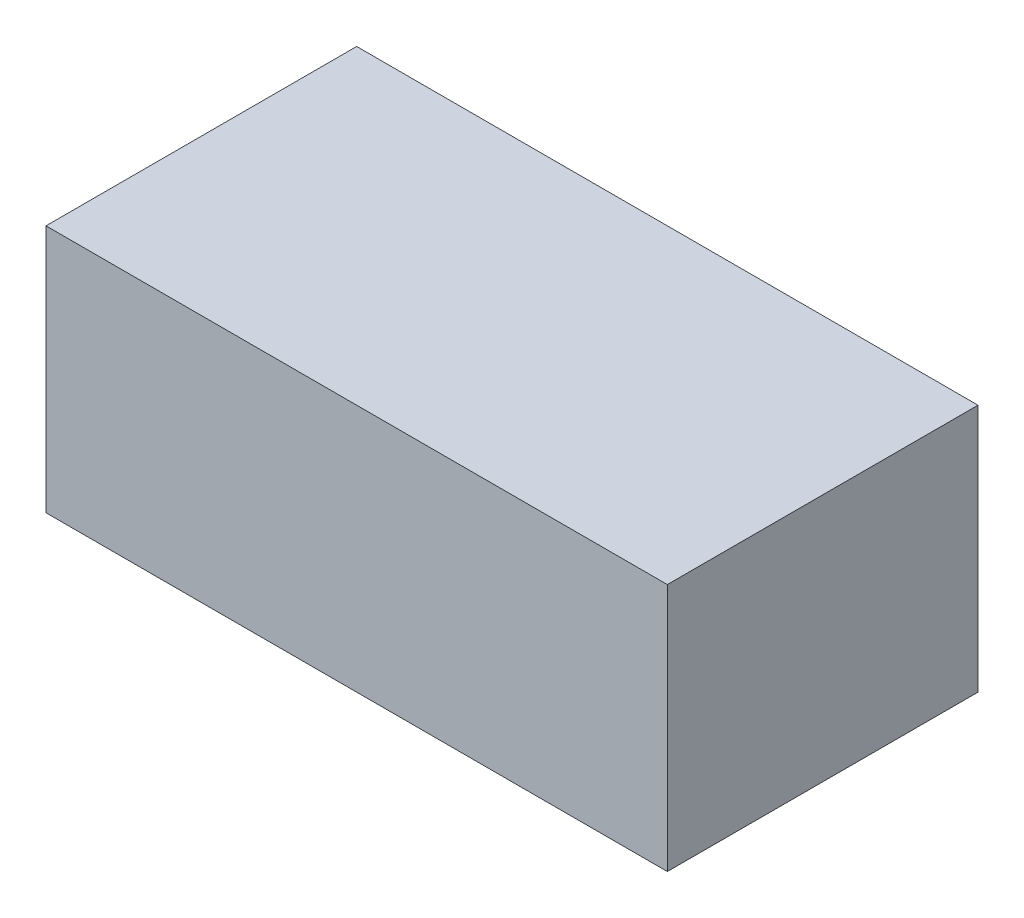
ISO-10303-21;
HEADER;
FILE_DESCRIPTION(('STEP AP214'),'2;1');
FILE_NAME('part.step','',(''),(''),'','','');
FILE_SCHEMA(('AUTOMOTIVE_DESIGN { 1 0 10303 214 1 1 1 1 }'));
ENDSEC;
DATA;
#1=APPLICATION_CONTEXT('core data for automotive mechanical design processes');
#2=APPLICATION_PROTOCOL_DEFINITION('international standard','automotive_design',2000,#1);
#3=PRODUCT_CONTEXT('',#1,'mechanical');
#4=PRODUCT('Part','Part','',(#3));
#5=PRODUCT_RELATED_PRODUCT_CATEGORY('part','',(#4));
#6=PRODUCT_DEFINITION_FORMATION('','',#4);
#7=PRODUCT_DEFINITION_CONTEXT('part definition',#1,'design');
#8=PRODUCT_DEFINITION('design','',#6,#7);
#9=PRODUCT_DEFINITION_SHAPE('','',#8);
#10=(LENGTH_UNIT() NAMED_UNIT(*) SI_UNIT(.MILLI.,.METRE.));
#11=(NAMED_UNIT(*) PLANE_ANGLE_UNIT() SI_UNIT($,.RADIAN.));
#12=(NAMED_UNIT(*) SI_UNIT($,.STERADIAN.) SOLID_ANGLE_UNIT());
#13=UNCERTAINTY_MEASURE_WITH_UNIT(LENGTH_MEASURE(1.E-05),#10,'distance_accuracy_value','');
#14=(GEOMETRIC_REPRESENTATION_CONTEXT(3) GLOBAL_UNCERTAINTY_ASSIGNED_CONTEXT((#13)) GLOBAL_UNIT_ASSIGNED_CONTEXT((#10,
#11,#12)) REPRESENTATION_CONTEXT('',''));
#15=CARTESIAN_POINT('',(0.,0.,0.));
#16=DIRECTION('',(0.,0.,1.));
#17=DIRECTION('',(1.,0.,0.));
#18=AXIS2_PLACEMENT_3D('',#15,#16,#17);
#19=CARTESIAN_POINT('',(50.,40.,-25.));
#20=DIRECTION('',(-1.,0.,0.));
#21=DIRECTION('',(0.,0.,1.));
#22=AXIS2_PLACEMENT_3D('',#19,#20,#21);
#23=PLANE('',#22);
#24=DIRECTION('',(0.,0.,-1.));
#25=VECTOR('',#24,1.);
#26=CARTESIAN_POINT('',(50.,0.,-25.));
#27=LINE('',#26,#25);
#28=CARTESIAN_POINT('',(50.,0.,25.));
#29=VERTEX_POINT('',#28);
#30=CARTESIAN_POINT('',(50.,0.,-25.));
#31=VERTEX_POINT('',#30);
#32=EDGE_CURVE('E111',#29,#31,#27,.T.);
#33=ORIENTED_EDGE('',*,*,#32,.T.);
#34=DIRECTION('',(0.,-1.,0.));
#35=VECTOR('',#34,1.);
#36=CARTESIAN_POINT('',(50.,40.,-25.));
#37=LINE('',#36,#35);
#38=CARTESIAN_POINT('',(50.,40.,-25.));
#39=VERTEX_POINT('',#38);
#40=EDGE_CURVE('E11',#39,#31,#37,.T.);
#41=ORIENTED_EDGE('',*,*,#40,.F.);
#42=DIRECTION('',(0.,0.,-1.));
#43=VECTOR('',#42,1.);
#44=CARTESIAN_POINT('',(50.,40.,-25.));
#45=LINE('',#44,#43);
#46=CARTESIAN_POINT('',(50.,40.,25.));
#47=VERTEX_POINT('',#46);
#48=EDGE_CURVE('E95',#47,#39,#45,.T.);
#49=ORIENTED_EDGE('',*,*,#48,.F.);
#50=DIRECTION('',(0.,-1.,0.));
#51=VECTOR('',#50,1.);
#52=CARTESIAN_POINT('',(50.,40.,25.));
#53=LINE('',#52,#51);
#54=EDGE_CURVE('E107',#47,#29,#53,.T.);
#55=ORIENTED_EDGE('',*,*,#54,.T.);
#56=EDGE_LOOP('',(#33,#41,#49,#55));
#57=FACE_BOUND('',#56,.T.);
#58=ADVANCED_FACE('F43',(#57),#23,.F.);
#59=CARTESIAN_POINT('',(-50.,40.,-25.));
#60=DIRECTION('',(0.,0.,1.));
#61=DIRECTION('',(1.,0.,0.));
#62=AXIS2_PLACEMENT_3D('',#59,#60,#61);
#63=PLANE('',#62);
#64=DIRECTION('',(-1.,0.,0.));
#65=VECTOR('',#64,1.);
#66=CARTESIAN_POINT('',(-50.,0.,-25.));
#67=LINE('',#66,#65);
#68=CARTESIAN_POINT('',(-50.,0.,-25.));
#69=VERTEX_POINT('',#68);
#70=EDGE_CURVE('E100',#31,#69,#67,.T.);
#71=ORIENTED_EDGE('',*,*,#70,.T.);
#72=DIRECTION('',(0.,-1.,0.));
#73=VECTOR('',#72,1.);
#74=CARTESIAN_POINT('',(-50.,40.,-25.));
#75=LINE('',#74,#73);
#76=CARTESIAN_POINT('',(-50.,40.,-25.));
#77=VERTEX_POINT('',#76);
#78=EDGE_CURVE('E52',#77,#69,#75,.T.);
#79=ORIENTED_EDGE('',*,*,#78,.F.);
#80=DIRECTION('',(-1.,0.,0.));
#81=VECTOR('',#80,1.);
#82=CARTESIAN_POINT('',(-50.,40.,-25.));
#83=LINE('',#82,#81);
#84=EDGE_CURVE('E90',#39,#77,#83,.T.);
#85=ORIENTED_EDGE('',*,*,#84,.F.);
#86=ORIENTED_EDGE('',*,*,#40,.T.);
#87=EDGE_LOOP('',(#71,#79,#85,#86));
#88=FACE_BOUND('',#87,.T.);
#89=ADVANCED_FACE('F99',(#88),#63,.F.);
#90=CARTESIAN_POINT('',(-50.,40.,-25.));
#91=DIRECTION('',(1.,0.,0.));
#92=DIRECTION('',(0.,0.,-1.));
#93=AXIS2_PLACEMENT_3D('',#90,#91,#92);
#94=PLANE('',#93);
#95=DIRECTION('',(0.,0.,1.));
#96=VECTOR('',#95,1.);
#97=CARTESIAN_POINT('',(-50.,0.,-25.));
#98=LINE('',#97,#96);
#99=CARTESIAN_POINT('',(-50.,0.,25.));
#100=VERTEX_POINT('',#99);
#101=EDGE_CURVE('E77',#69,#100,#98,.T.);
#102=ORIENTED_EDGE('',*,*,#101,.T.);
#103=DIRECTION('',(0.,-1.,0.));
#104=VECTOR('',#103,1.);
#105=CARTESIAN_POINT('',(-50.,40.,25.));
#106=LINE('',#105,#104);
#107=CARTESIAN_POINT('',(-50.,40.,25.));
#108=VERTEX_POINT('',#107);
#109=EDGE_CURVE('E102',#108,#100,#106,.T.);
#110=ORIENTED_EDGE('',*,*,#109,.F.);
#111=DIRECTION('',(0.,0.,1.));
#112=VECTOR('',#111,1.);
#113=CARTESIAN_POINT('',(-50.,40.,-25.));
#114=LINE('',#113,#112);
#115=EDGE_CURVE('E93',#77,#108,#114,.T.);
#116=ORIENTED_EDGE('',*,*,#115,.F.);
#117=ORIENTED_EDGE('',*,*,#78,.T.);
#118=EDGE_LOOP('',(#102,#110,#116,#117));
#119=FACE_BOUND('',#118,.T.);
#120=ADVANCED_FACE('F103',(#119),#94,.F.);
#121=CARTESIAN_POINT('',(-50.,40.,25.));
#122=DIRECTION('',(0.,0.,-1.));
#123=DIRECTION('',(-1.,0.,0.));
#124=AXIS2_PLACEMENT_3D('',#121,#122,#123);
#125=PLANE('',#124);
#126=DIRECTION('',(1.,0.,0.));
#127=VECTOR('',#126,1.);
#128=CARTESIAN_POINT('',(-50.,0.,25.));
#129=LINE('',#128,#127);
#130=EDGE_CURVE('E83',#100,#29,#129,.T.);
#131=ORIENTED_EDGE('',*,*,#130,.T.);
#132=ORIENTED_EDGE('',*,*,#54,.F.);
#133=DIRECTION('',(1.,0.,0.));
#134=VECTOR('',#133,1.);
#135=CARTESIAN_POINT('',(-50.,40.,25.));
#136=LINE('',#135,#134);
#137=EDGE_CURVE('E60',#108,#47,#136,.T.);
#138=ORIENTED_EDGE('',*,*,#137,.F.);
#139=ORIENTED_EDGE('',*,*,#109,.T.);
#140=EDGE_LOOP('',(#131,#132,#138,#139));
#141=FACE_BOUND('',#140,.T.);
#142=ADVANCED_FACE('F124',(#141),#125,.F.);
#143=CARTESIAN_POINT('',(0.,40.,0.));
#144=DIRECTION('',(0.,1.,0.));
#145=DIRECTION('',(0.,0.,1.));
#146=AXIS2_PLACEMENT_3D('',#143,#144,#145);
#147=PLANE('',#146);
#148=ORIENTED_EDGE('',*,*,#48,.T.);
#149=ORIENTED_EDGE('',*,*,#84,.T.);
#150=ORIENTED_EDGE('',*,*,#115,.T.);
#151=ORIENTED_EDGE('',*,*,#137,.T.);
#152=EDGE_LOOP('',(#148,#149,#150,#151));
#153=FACE_BOUND('',#152,.T.);
#154=ADVANCED_FACE('F91',(#153),#147,.T.);
#155=CARTESIAN_POINT('',(0.,0.,0.));
#156=DIRECTION('',(0.,1.,0.));
#157=DIRECTION('',(0.,0.,1.));
#158=AXIS2_PLACEMENT_3D('',#155,#156,#157);
#159=PLANE('',#158);
#160=ORIENTED_EDGE('',*,*,#32,.F.);
#161=ORIENTED_EDGE('',*,*,#130,.F.);
#162=ORIENTED_EDGE('',*,*,#101,.F.);
#163=ORIENTED_EDGE('',*,*,#70,.F.);
#164=EDGE_LOOP('',(#160,#161,#162,#163));
#165=FACE_BOUND('',#164,.T.);
#166=ADVANCED_FACE('F127',(#165),#159,.F.);
#167=CLOSED_SHELL('',(#58,#89,#120,#142,#154,#166));
#168=MANIFOLD_SOLID_BREP('B2',#167);
#169=ADVANCED_BREP_SHAPE_REPRESENTATION('',(#18,#168),#14);
#170=SHAPE_DEFINITION_REPRESENTATION(#9,#169);
ENDSEC;
END-ISO-10303-21;
